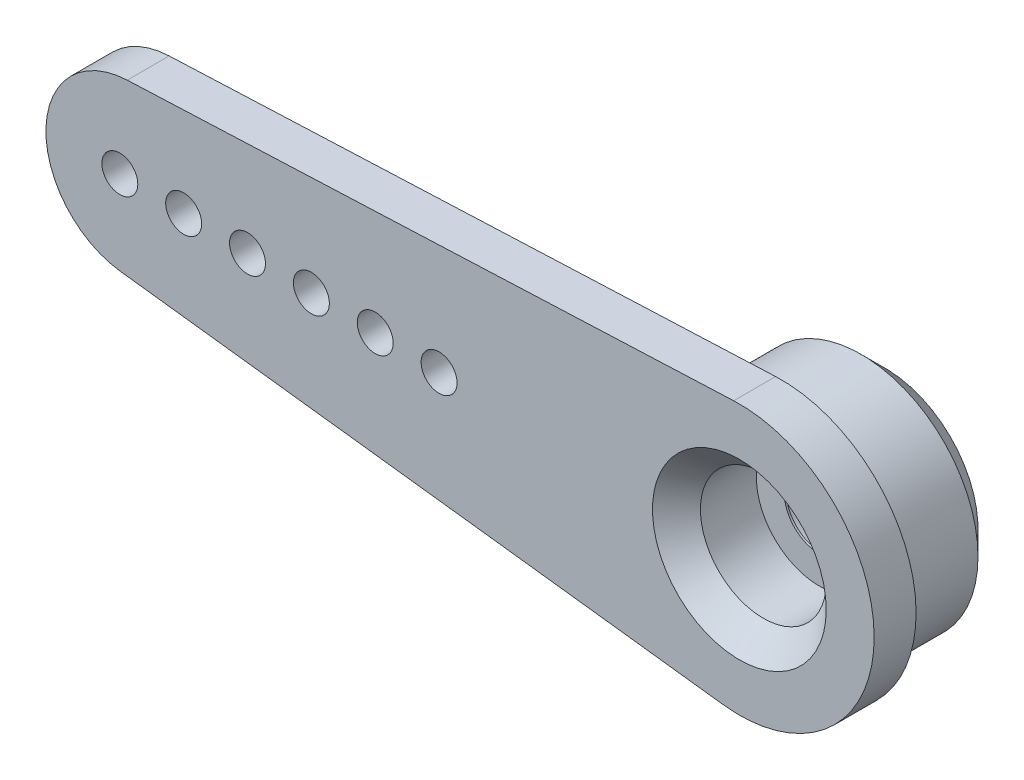
ISO-10303-21;
HEADER;
FILE_DESCRIPTION(('STEP AP214'),'2;1');
FILE_NAME('part.step','',(''),(''),'','','');
FILE_SCHEMA(('AUTOMOTIVE_DESIGN { 1 0 10303 214 1 1 1 1 }'));
ENDSEC;
DATA;
#1=APPLICATION_CONTEXT('core data for automotive mechanical design processes');
#2=APPLICATION_PROTOCOL_DEFINITION('international standard','automotive_design',2000,#1);
#3=PRODUCT_CONTEXT('',#1,'mechanical');
#4=PRODUCT('Part','Part','',(#3));
#5=PRODUCT_RELATED_PRODUCT_CATEGORY('part','',(#4));
#6=PRODUCT_DEFINITION_FORMATION('','',#4);
#7=PRODUCT_DEFINITION_CONTEXT('part definition',#1,'design');
#8=PRODUCT_DEFINITION('design','',#6,#7);
#9=PRODUCT_DEFINITION_SHAPE('','',#8);
#10=(LENGTH_UNIT() NAMED_UNIT(*) SI_UNIT(.MILLI.,.METRE.));
#11=(NAMED_UNIT(*) PLANE_ANGLE_UNIT() SI_UNIT($,.RADIAN.));
#12=(NAMED_UNIT(*) SI_UNIT($,.STERADIAN.) SOLID_ANGLE_UNIT());
#13=UNCERTAINTY_MEASURE_WITH_UNIT(LENGTH_MEASURE(1.E-05),#10,'distance_accuracy_value','');
#14=(GEOMETRIC_REPRESENTATION_CONTEXT(3) GLOBAL_UNCERTAINTY_ASSIGNED_CONTEXT((#13)) GLOBAL_UNIT_ASSIGNED_CONTEXT((#10,
#11,#12)) REPRESENTATION_CONTEXT('',''));
#15=CARTESIAN_POINT('',(0.,0.,0.));
#16=DIRECTION('',(0.,0.,1.));
#17=DIRECTION('',(1.,0.,0.));
#18=AXIS2_PLACEMENT_3D('',#15,#16,#17);
#19=CARTESIAN_POINT('',(30.4756920576618,-1.21745373898422,2.1));
#20=DIRECTION('',(0.,0.,-1.));
#21=DIRECTION('',(-1.,0.,0.));
#22=AXIS2_PLACEMENT_3D('',#19,#20,#21);
#23=CYLINDRICAL_SURFACE('',#22,1.75);
#24=CARTESIAN_POINT('',(30.4756920576618,-1.21745373898422,-1.9));
#25=DIRECTION('',(0.,0.,1.));
#26=DIRECTION('',(1.,0.,0.));
#27=AXIS2_PLACEMENT_3D('',#24,#25,#26);
#28=CIRCLE('',#27,1.75);
#29=CARTESIAN_POINT('',(32.2256920576618,-1.21745373898422,-1.9));
#30=VERTEX_POINT('',#29);
#31=EDGE_CURVE('E102',#30,#30,#28,.F.);
#32=ORIENTED_EDGE('',*,*,#31,.F.);
#33=EDGE_LOOP('',(#32));
#34=FACE_BOUND('',#33,.T.);
#35=CARTESIAN_POINT('',(30.4756920576618,-1.21745373898422,-2.));
#36=DIRECTION('',(0.,0.,-1.));
#37=DIRECTION('',(-1.,0.,0.));
#38=AXIS2_PLACEMENT_3D('',#35,#36,#37);
#39=CIRCLE('',#38,1.75);
#40=CARTESIAN_POINT('',(28.7256920576618,-1.21745373898422,-2.));
#41=VERTEX_POINT('',#40);
#42=EDGE_CURVE('E116',#41,#41,#39,.F.);
#43=ORIENTED_EDGE('',*,*,#42,.F.);
#44=EDGE_LOOP('',(#43));
#45=FACE_BOUND('',#44,.T.);
#46=ADVANCED_FACE('F31',(#34,#45),#23,.F.);
#47=CARTESIAN_POINT('',(0.,0.,0.));
#48=DIRECTION('',(0.,0.,1.));
#49=DIRECTION('',(1.,0.,0.));
#50=AXIS2_PLACEMENT_3D('',#47,#48,#49);
#51=PLANE('',#50);
#52=CARTESIAN_POINT('',(15.4376958737506,-0.627360062849379,0.));
#53=DIRECTION('',(0.,0.,1.));
#54=DIRECTION('',(1.,0.,0.));
#55=AXIS2_PLACEMENT_3D('',#52,#53,#54);
#56=CIRCLE('',#55,0.899999999999993);
#57=CARTESIAN_POINT('',(16.3376958737506,-0.627360062849379,0.));
#58=VERTEX_POINT('',#57);
#59=EDGE_CURVE('E225',#58,#58,#56,.T.);
#60=ORIENTED_EDGE('',*,*,#59,.T.);
#61=EDGE_LOOP('',(#60));
#62=FACE_BOUND('',#61,.T.);
#63=CARTESIAN_POINT('',(12.2401566990005,-0.501888050279503,0.));
#64=DIRECTION('',(0.,0.,1.));
#65=DIRECTION('',(1.,0.,0.));
#66=AXIS2_PLACEMENT_3D('',#63,#64,#65);
#67=CIRCLE('',#66,0.899999999999993);
#68=CARTESIAN_POINT('',(13.1401566990005,-0.501888050279503,0.));
#69=VERTEX_POINT('',#68);
#70=EDGE_CURVE('E219',#69,#69,#67,.T.);
#71=ORIENTED_EDGE('',*,*,#70,.T.);
#72=EDGE_LOOP('',(#71));
#73=FACE_BOUND('',#72,.T.);
#74=CARTESIAN_POINT('',(9.04261752425036,-0.376416037709628,0.));
#75=DIRECTION('',(0.,0.,1.));
#76=DIRECTION('',(1.,0.,0.));
#77=AXIS2_PLACEMENT_3D('',#74,#75,#76);
#78=CIRCLE('',#77,0.899999999999993);
#79=CARTESIAN_POINT('',(9.94261752425035,-0.376416037709628,0.));
#80=VERTEX_POINT('',#79);
#81=EDGE_CURVE('E213',#80,#80,#78,.T.);
#82=ORIENTED_EDGE('',*,*,#81,.T.);
#83=EDGE_LOOP('',(#82));
#84=FACE_BOUND('',#83,.T.);
#85=CARTESIAN_POINT('',(5.84507834950024,-0.250944025139752,0.));
#86=DIRECTION('',(0.,0.,1.));
#87=DIRECTION('',(1.,0.,0.));
#88=AXIS2_PLACEMENT_3D('',#85,#86,#87);
#89=CIRCLE('',#88,0.899999999999993);
#90=CARTESIAN_POINT('',(6.74507834950023,-0.250944025139752,0.));
#91=VERTEX_POINT('',#90);
#92=EDGE_CURVE('E207',#91,#91,#89,.T.);
#93=ORIENTED_EDGE('',*,*,#92,.T.);
#94=EDGE_LOOP('',(#93));
#95=FACE_BOUND('',#94,.T.);
#96=CARTESIAN_POINT('',(2.64753917475012,-0.125472012569876,0.));
#97=DIRECTION('',(0.,0.,1.));
#98=DIRECTION('',(1.,0.,0.));
#99=AXIS2_PLACEMENT_3D('',#96,#97,#98);
#100=CIRCLE('',#99,0.899999999999993);
#101=CARTESIAN_POINT('',(3.54753917475011,-0.125472012569876,0.));
#102=VERTEX_POINT('',#101);
#103=EDGE_CURVE('E201',#102,#102,#100,.T.);
#104=ORIENTED_EDGE('',*,*,#103,.T.);
#105=EDGE_LOOP('',(#104));
#106=FACE_BOUND('',#105,.T.);
#107=CARTESIAN_POINT('',(-0.55,0.,0.));
#108=DIRECTION('',(0.,0.,1.));
#109=DIRECTION('',(1.,0.,0.));
#110=AXIS2_PLACEMENT_3D('',#107,#108,#109);
#111=CIRCLE('',#110,0.899999999999993);
#112=CARTESIAN_POINT('',(0.349999999999993,0.,0.));
#113=VERTEX_POINT('',#112);
#114=EDGE_CURVE('E193',#113,#113,#111,.T.);
#115=ORIENTED_EDGE('',*,*,#114,.T.);
#116=EDGE_LOOP('',(#115));
#117=FACE_BOUND('',#116,.T.);
#118=CARTESIAN_POINT('',(0.,0.,0.));
#119=DIRECTION('',(0.,0.,1.));
#120=DIRECTION('',(1.,0.,0.));
#121=AXIS2_PLACEMENT_3D('',#118,#119,#120);
#122=CIRCLE('',#121,4.25);
#123=CARTESIAN_POINT('',(-0.179008677112837,4.24622843162239,0.));
#124=VERTEX_POINT('',#123);
#125=CARTESIAN_POINT('',(-0.517157360216176,-4.21841774422286,0.));
#126=VERTEX_POINT('',#125);
#127=EDGE_CURVE('E99',#124,#126,#122,.T.);
#128=ORIENTED_EDGE('',*,*,#127,.F.);
#129=DIRECTION('',(-0.999112572146444,-0.0421196887324321,0.));
#130=VECTOR('',#129,1.);
#131=CARTESIAN_POINT('',(-0.179008677112837,4.24622843162239,0.));
#132=LINE('',#131,#130);
#133=CARTESIAN_POINT('',(30.1913841587179,5.52655612300428,0.));
#134=VERTEX_POINT('',#133);
#135=EDGE_CURVE('E71',#134,#124,#132,.T.);
#136=ORIENTED_EDGE('',*,*,#135,.F.);
#137=CARTESIAN_POINT('',(30.4756920576618,-1.21745373898422,0.));
#138=DIRECTION('',(0.,0.,1.));
#139=DIRECTION('',(1.,0.,0.));
#140=AXIS2_PLACEMENT_3D('',#137,#138,#139);
#141=CIRCLE('',#140,6.75);
#142=CARTESIAN_POINT('',(29.6543244855538,-7.91729368569111,0.));
#143=VERTEX_POINT('',#142);
#144=EDGE_CURVE('E65',#143,#134,#141,.T.);
#145=ORIENTED_EDGE('',*,*,#144,.F.);
#146=DIRECTION('',(0.992568880993613,-0.121684084756747,0.));
#147=VECTOR('',#146,1.);
#148=CARTESIAN_POINT('',(-0.517157360216176,-4.21841774422286,0.));
#149=LINE('',#148,#147);
#150=EDGE_CURVE('E89',#126,#143,#149,.T.);
#151=ORIENTED_EDGE('',*,*,#150,.F.);
#152=EDGE_LOOP('',(#128,#136,#145,#151));
#153=FACE_BOUND('',#152,.T.);
#154=CARTESIAN_POINT('',(30.4756920576618,-1.21745373898422,0.));
#155=DIRECTION('',(0.,0.,1.));
#156=DIRECTION('',(1.,0.,0.));
#157=AXIS2_PLACEMENT_3D('',#154,#155,#156);
#158=CIRCLE('',#157,5.85);
#159=CARTESIAN_POINT('',(36.3256920576618,-1.21745373898422,0.));
#160=VERTEX_POINT('',#159);
#161=EDGE_CURVE('E109',#160,#160,#158,.F.);
#162=ORIENTED_EDGE('',*,*,#161,.F.);
#163=EDGE_LOOP('',(#162));
#164=FACE_BOUND('',#163,.T.);
#165=ADVANCED_FACE('F145',(#62,#73,#84,#95,#106,#117,#153,#164),#51,.F.);
#166=CARTESIAN_POINT('',(0.,0.,2.1));
#167=DIRECTION('',(0.,0.,-1.));
#168=DIRECTION('',(-1.,0.,0.));
#169=AXIS2_PLACEMENT_3D('',#166,#167,#168);
#170=CYLINDRICAL_SURFACE('',#169,4.25);
#171=ORIENTED_EDGE('',*,*,#127,.T.);
#172=DIRECTION('',(0.,0.,-1.));
#173=VECTOR('',#172,1.);
#174=CARTESIAN_POINT('',(-0.517157360216176,-4.21841774422286,2.1));
#175=LINE('',#174,#173);
#176=CARTESIAN_POINT('',(-0.517157360216176,-4.21841774422286,2.1));
#177=VERTEX_POINT('',#176);
#178=EDGE_CURVE('E90',#177,#126,#175,.T.);
#179=ORIENTED_EDGE('',*,*,#178,.F.);
#180=CARTESIAN_POINT('',(0.,0.,2.1));
#181=DIRECTION('',(0.,0.,1.));
#182=DIRECTION('',(1.,0.,0.));
#183=AXIS2_PLACEMENT_3D('',#180,#181,#182);
#184=CIRCLE('',#183,4.25);
#185=CARTESIAN_POINT('',(-0.179008677112837,4.24622843162239,2.1));
#186=VERTEX_POINT('',#185);
#187=EDGE_CURVE('E84',#186,#177,#184,.T.);
#188=ORIENTED_EDGE('',*,*,#187,.F.);
#189=DIRECTION('',(0.,0.,-1.));
#190=VECTOR('',#189,1.);
#191=CARTESIAN_POINT('',(-0.179008677112837,4.24622843162239,2.1));
#192=LINE('',#191,#190);
#193=EDGE_CURVE('E95',#186,#124,#192,.T.);
#194=ORIENTED_EDGE('',*,*,#193,.T.);
#195=EDGE_LOOP('',(#171,#179,#188,#194));
#196=FACE_BOUND('',#195,.T.);
#197=ADVANCED_FACE('F152',(#196),#170,.T.);
#198=CARTESIAN_POINT('',(-0.517157360216176,-4.21841774422286,2.1));
#199=DIRECTION('',(0.121684084756747,0.992568880993613,0.));
#200=DIRECTION('',(-0.992568880993613,0.121684084756747,0.));
#201=AXIS2_PLACEMENT_3D('',#198,#199,#200);
#202=PLANE('',#201);
#203=ORIENTED_EDGE('',*,*,#150,.T.);
#204=DIRECTION('',(0.,0.,-1.));
#205=VECTOR('',#204,1.);
#206=CARTESIAN_POINT('',(29.6543244855538,-7.91729368569111,2.1));
#207=LINE('',#206,#205);
#208=CARTESIAN_POINT('',(29.6543244855538,-7.91729368569111,2.1));
#209=VERTEX_POINT('',#208);
#210=EDGE_CURVE('E87',#209,#143,#207,.T.);
#211=ORIENTED_EDGE('',*,*,#210,.F.);
#212=DIRECTION('',(0.992568880993613,-0.121684084756747,0.));
#213=VECTOR('',#212,1.);
#214=CARTESIAN_POINT('',(-0.517157360216176,-4.21841774422286,2.1));
#215=LINE('',#214,#213);
#216=EDGE_CURVE('E79',#177,#209,#215,.T.);
#217=ORIENTED_EDGE('',*,*,#216,.F.);
#218=ORIENTED_EDGE('',*,*,#178,.T.);
#219=EDGE_LOOP('',(#203,#211,#217,#218));
#220=FACE_BOUND('',#219,.T.);
#221=ADVANCED_FACE('F88',(#220),#202,.F.);
#222=CARTESIAN_POINT('',(30.4756920576618,-1.21745373898422,2.1));
#223=DIRECTION('',(0.,0.,-1.));
#224=DIRECTION('',(-1.,0.,0.));
#225=AXIS2_PLACEMENT_3D('',#222,#223,#224);
#226=CYLINDRICAL_SURFACE('',#225,6.75);
#227=ORIENTED_EDGE('',*,*,#144,.T.);
#228=DIRECTION('',(0.,0.,-1.));
#229=VECTOR('',#228,1.);
#230=CARTESIAN_POINT('',(30.1913841587179,5.52655612300428,2.1));
#231=LINE('',#230,#229);
#232=CARTESIAN_POINT('',(30.1913841587179,5.52655612300428,2.1));
#233=VERTEX_POINT('',#232);
#234=EDGE_CURVE('E91',#233,#134,#231,.T.);
#235=ORIENTED_EDGE('',*,*,#234,.F.);
#236=CARTESIAN_POINT('',(30.4756920576618,-1.21745373898422,2.1));
#237=DIRECTION('',(0.,0.,1.));
#238=DIRECTION('',(1.,0.,0.));
#239=AXIS2_PLACEMENT_3D('',#236,#237,#238);
#240=CIRCLE('',#239,6.75);
#241=EDGE_CURVE('E82',#209,#233,#240,.T.);
#242=ORIENTED_EDGE('',*,*,#241,.F.);
#243=ORIENTED_EDGE('',*,*,#210,.T.);
#244=EDGE_LOOP('',(#227,#235,#242,#243));
#245=FACE_BOUND('',#244,.T.);
#246=ADVANCED_FACE('F93',(#245),#226,.T.);
#247=CARTESIAN_POINT('',(-0.179008677112837,4.24622843162239,2.1));
#248=DIRECTION('',(0.0421196887324322,-0.999112572146444,0.));
#249=DIRECTION('',(0.999112572146444,0.0421196887324322,0.));
#250=AXIS2_PLACEMENT_3D('',#247,#248,#249);
#251=PLANE('',#250);
#252=ORIENTED_EDGE('',*,*,#135,.T.);
#253=ORIENTED_EDGE('',*,*,#193,.F.);
#254=DIRECTION('',(-0.999112572146444,-0.0421196887324321,0.));
#255=VECTOR('',#254,1.);
#256=CARTESIAN_POINT('',(-0.179008677112837,4.24622843162239,2.1));
#257=LINE('',#256,#255);
#258=EDGE_CURVE('E48',#233,#186,#257,.T.);
#259=ORIENTED_EDGE('',*,*,#258,.F.);
#260=ORIENTED_EDGE('',*,*,#234,.T.);
#261=EDGE_LOOP('',(#252,#253,#259,#260));
#262=FACE_BOUND('',#261,.T.);
#263=ADVANCED_FACE('F169',(#262),#251,.F.);
#264=CARTESIAN_POINT('',(0.,0.,2.1));
#265=DIRECTION('',(0.,0.,1.));
#266=DIRECTION('',(1.,0.,0.));
#267=AXIS2_PLACEMENT_3D('',#264,#265,#266);
#268=PLANE('',#267);
#269=CARTESIAN_POINT('',(15.4376958737506,-0.627360062849379,2.1));
#270=DIRECTION('',(0.,0.,1.));
#271=DIRECTION('',(1.,0.,0.));
#272=AXIS2_PLACEMENT_3D('',#269,#270,#271);
#273=CIRCLE('',#272,0.899999999999986);
#274=CARTESIAN_POINT('',(16.3376958737506,-0.627360062849379,2.1));
#275=VERTEX_POINT('',#274);
#276=EDGE_CURVE('E228',#275,#275,#273,.T.);
#277=ORIENTED_EDGE('',*,*,#276,.F.);
#278=EDGE_LOOP('',(#277));
#279=FACE_BOUND('',#278,.T.);
#280=CARTESIAN_POINT('',(12.2401566990005,-0.501888050279503,2.1));
#281=DIRECTION('',(0.,0.,1.));
#282=DIRECTION('',(1.,0.,0.));
#283=AXIS2_PLACEMENT_3D('',#280,#281,#282);
#284=CIRCLE('',#283,0.899999999999988);
#285=CARTESIAN_POINT('',(13.1401566990005,-0.501888050279503,2.1));
#286=VERTEX_POINT('',#285);
#287=EDGE_CURVE('E222',#286,#286,#284,.T.);
#288=ORIENTED_EDGE('',*,*,#287,.F.);
#289=EDGE_LOOP('',(#288));
#290=FACE_BOUND('',#289,.T.);
#291=CARTESIAN_POINT('',(9.04261752425036,-0.376416037709628,2.1));
#292=DIRECTION('',(0.,0.,1.));
#293=DIRECTION('',(1.,0.,0.));
#294=AXIS2_PLACEMENT_3D('',#291,#292,#293);
#295=CIRCLE('',#294,0.899999999999988);
#296=CARTESIAN_POINT('',(9.94261752425034,-0.376416037709628,2.1));
#297=VERTEX_POINT('',#296);
#298=EDGE_CURVE('E216',#297,#297,#295,.T.);
#299=ORIENTED_EDGE('',*,*,#298,.F.);
#300=EDGE_LOOP('',(#299));
#301=FACE_BOUND('',#300,.T.);
#302=CARTESIAN_POINT('',(5.84507834950024,-0.250944025139752,2.1));
#303=DIRECTION('',(0.,0.,1.));
#304=DIRECTION('',(1.,0.,0.));
#305=AXIS2_PLACEMENT_3D('',#302,#303,#304);
#306=CIRCLE('',#305,0.899999999999988);
#307=CARTESIAN_POINT('',(6.74507834950022,-0.250944025139752,2.1));
#308=VERTEX_POINT('',#307);
#309=EDGE_CURVE('E210',#308,#308,#306,.T.);
#310=ORIENTED_EDGE('',*,*,#309,.F.);
#311=EDGE_LOOP('',(#310));
#312=FACE_BOUND('',#311,.T.);
#313=CARTESIAN_POINT('',(2.64753917475012,-0.125472012569876,2.1));
#314=DIRECTION('',(0.,0.,1.));
#315=DIRECTION('',(1.,0.,0.));
#316=AXIS2_PLACEMENT_3D('',#313,#314,#315);
#317=CIRCLE('',#316,0.899999999999988);
#318=CARTESIAN_POINT('',(3.54753917475011,-0.125472012569876,2.1));
#319=VERTEX_POINT('',#318);
#320=EDGE_CURVE('E204',#319,#319,#317,.T.);
#321=ORIENTED_EDGE('',*,*,#320,.F.);
#322=EDGE_LOOP('',(#321));
#323=FACE_BOUND('',#322,.T.);
#324=CARTESIAN_POINT('',(-0.55,0.,2.1));
#325=DIRECTION('',(0.,0.,1.));
#326=DIRECTION('',(1.,0.,0.));
#327=AXIS2_PLACEMENT_3D('',#324,#325,#326);
#328=CIRCLE('',#327,0.899999999999988);
#329=CARTESIAN_POINT('',(0.349999999999988,0.,2.1));
#330=VERTEX_POINT('',#329);
#331=EDGE_CURVE('E198',#330,#330,#328,.T.);
#332=ORIENTED_EDGE('',*,*,#331,.F.);
#333=EDGE_LOOP('',(#332));
#334=FACE_BOUND('',#333,.T.);
#335=CARTESIAN_POINT('',(30.4756920576618,-1.21745373898422,2.1));
#336=DIRECTION('',(0.,0.,1.));
#337=DIRECTION('',(1.,0.,0.));
#338=AXIS2_PLACEMENT_3D('',#335,#336,#337);
#339=CIRCLE('',#338,4.35);
#340=CARTESIAN_POINT('',(34.8256920576618,-1.21745373898422,2.1));
#341=VERTEX_POINT('',#340);
#342=EDGE_CURVE('E122',#341,#341,#339,.F.);
#343=ORIENTED_EDGE('',*,*,#342,.T.);
#344=EDGE_LOOP('',(#343));
#345=FACE_BOUND('',#344,.T.);
#346=ORIENTED_EDGE('',*,*,#187,.T.);
#347=ORIENTED_EDGE('',*,*,#216,.T.);
#348=ORIENTED_EDGE('',*,*,#241,.T.);
#349=ORIENTED_EDGE('',*,*,#258,.T.);
#350=EDGE_LOOP('',(#346,#347,#348,#349));
#351=FACE_BOUND('',#350,.T.);
#352=ADVANCED_FACE('F80',(#279,#290,#301,#312,#323,#334,#345,#351),#268,.T.);
#353=CARTESIAN_POINT('',(30.4756920576618,-1.21745373898422,-5.2));
#354=DIRECTION('',(0.,0.,1.));
#355=DIRECTION('',(1.,0.,0.));
#356=AXIS2_PLACEMENT_3D('',#353,#354,#355);
#357=CYLINDRICAL_SURFACE('',#356,5.85);
#358=CARTESIAN_POINT('',(30.4756920576618,-1.21745373898422,-3.99999999999999));
#359=DIRECTION('',(0.,0.,-1.));
#360=DIRECTION('',(-1.,0.,0.));
#361=AXIS2_PLACEMENT_3D('',#358,#359,#360);
#362=CIRCLE('',#361,5.85);
#363=CARTESIAN_POINT('',(24.6256920576618,-1.21745373898422,-3.99999999999999));
#364=VERTEX_POINT('',#363);
#365=EDGE_CURVE('E11',#364,#364,#362,.F.);
#366=ORIENTED_EDGE('',*,*,#365,.T.);
#367=EDGE_LOOP('',(#366));
#368=FACE_BOUND('',#367,.T.);
#369=ORIENTED_EDGE('',*,*,#161,.T.);
#370=EDGE_LOOP('',(#369));
#371=FACE_BOUND('',#370,.T.);
#372=ADVANCED_FACE('F164',(#368,#371),#357,.T.);
#373=CARTESIAN_POINT('',(30.4756920576618,-1.21745373898422,-5.2));
#374=DIRECTION('',(0.,0.,-1.));
#375=DIRECTION('',(-1.,0.,0.));
#376=AXIS2_PLACEMENT_3D('',#373,#374,#375);
#377=PLANE('',#376);
#378=CARTESIAN_POINT('',(30.4756920576618,-1.21745373898422,-5.2));
#379=DIRECTION('',(0.,0.,-1.));
#380=DIRECTION('',(-1.,0.,0.));
#381=AXIS2_PLACEMENT_3D('',#378,#379,#380);
#382=CIRCLE('',#381,4.65);
#383=CARTESIAN_POINT('',(25.8256920576618,-1.21745373898422,-5.2));
#384=VERTEX_POINT('',#383);
#385=EDGE_CURVE('E40',#384,#384,#382,.T.);
#386=ORIENTED_EDGE('',*,*,#385,.T.);
#387=EDGE_LOOP('',(#386));
#388=FACE_BOUND('',#387,.T.);
#389=CARTESIAN_POINT('',(30.4756920576618,-1.21745373898422,-5.2));
#390=DIRECTION('',(0.,0.,-1.));
#391=DIRECTION('',(-1.,0.,0.));
#392=AXIS2_PLACEMENT_3D('',#389,#390,#391);
#393=CIRCLE('',#392,2.95);
#394=CARTESIAN_POINT('',(27.5256920576618,-1.21745373898422,-5.2));
#395=VERTEX_POINT('',#394);
#396=EDGE_CURVE('E190',#395,#395,#393,.T.);
#397=ORIENTED_EDGE('',*,*,#396,.F.);
#398=EDGE_LOOP('',(#397));
#399=FACE_BOUND('',#398,.T.);
#400=ADVANCED_FACE('F127',(#388,#399),#377,.T.);
#401=CARTESIAN_POINT('',(30.4756920576618,-1.21745373898422,-1.9));
#402=DIRECTION('',(0.,0.,1.));
#403=DIRECTION('',(1.,0.,0.));
#404=AXIS2_PLACEMENT_3D('',#401,#402,#403);
#405=PLANE('',#404);
#406=CARTESIAN_POINT('',(30.4756920576618,-1.21745373898422,-1.9));
#407=DIRECTION('',(0.,0.,1.));
#408=DIRECTION('',(1.,0.,0.));
#409=AXIS2_PLACEMENT_3D('',#406,#407,#408);
#410=CIRCLE('',#409,3.15);
#411=CARTESIAN_POINT('',(33.6256920576618,-1.21745373898422,-1.9));
#412=VERTEX_POINT('',#411);
#413=EDGE_CURVE('E115',#412,#412,#410,.T.);
#414=ORIENTED_EDGE('',*,*,#413,.T.);
#415=EDGE_LOOP('',(#414));
#416=FACE_BOUND('',#415,.T.);
#417=ORIENTED_EDGE('',*,*,#31,.T.);
#418=EDGE_LOOP('',(#417));
#419=FACE_BOUND('',#418,.T.);
#420=ADVANCED_FACE('F163',(#416,#419),#405,.T.);
#421=CARTESIAN_POINT('',(30.4756920576618,-1.21745373898422,-1.9));
#422=DIRECTION('',(0.,0.,1.));
#423=DIRECTION('',(1.,0.,0.));
#424=AXIS2_PLACEMENT_3D('',#421,#422,#423);
#425=CYLINDRICAL_SURFACE('',#424,3.15);
#426=CARTESIAN_POINT('',(30.4756920576618,-1.21745373898422,0.900000000000003));
#427=DIRECTION('',(0.,0.,1.));
#428=DIRECTION('',(1.,0.,0.));
#429=AXIS2_PLACEMENT_3D('',#426,#427,#428);
#430=CIRCLE('',#429,3.15);
#431=CARTESIAN_POINT('',(33.6256920576618,-1.21745373898422,0.900000000000003));
#432=VERTEX_POINT('',#431);
#433=EDGE_CURVE('E112',#432,#432,#430,.T.);
#434=ORIENTED_EDGE('',*,*,#433,.T.);
#435=EDGE_LOOP('',(#434));
#436=FACE_BOUND('',#435,.T.);
#437=ORIENTED_EDGE('',*,*,#413,.F.);
#438=EDGE_LOOP('',(#437));
#439=FACE_BOUND('',#438,.T.);
#440=ADVANCED_FACE('F159',(#436,#439),#425,.F.);
#441=CARTESIAN_POINT('',(30.4756920576618,-1.21745373898422,-2.));
#442=DIRECTION('',(0.,0.,-1.));
#443=DIRECTION('',(-1.,0.,0.));
#444=AXIS2_PLACEMENT_3D('',#441,#442,#443);
#445=PLANE('',#444);
#446=CARTESIAN_POINT('',(30.4756920576618,-1.21745373898422,-2.));
#447=DIRECTION('',(0.,0.,-1.));
#448=DIRECTION('',(-1.,0.,0.));
#449=AXIS2_PLACEMENT_3D('',#446,#447,#448);
#450=CIRCLE('',#449,2.95);
#451=CARTESIAN_POINT('',(27.5256920576618,-1.21745373898422,-2.));
#452=VERTEX_POINT('',#451);
#453=EDGE_CURVE('E119',#452,#452,#450,.T.);
#454=ORIENTED_EDGE('',*,*,#453,.T.);
#455=EDGE_LOOP('',(#454));
#456=FACE_BOUND('',#455,.T.);
#457=ORIENTED_EDGE('',*,*,#42,.T.);
#458=EDGE_LOOP('',(#457));
#459=FACE_BOUND('',#458,.T.);
#460=ADVANCED_FACE('F251',(#456,#459),#445,.T.);
#461=CARTESIAN_POINT('',(30.4756920576618,-1.21745373898422,-2.));
#462=DIRECTION('',(0.,0.,-1.));
#463=DIRECTION('',(-1.,0.,0.));
#464=AXIS2_PLACEMENT_3D('',#461,#462,#463);
#465=CYLINDRICAL_SURFACE('',#464,2.95);
#466=ORIENTED_EDGE('',*,*,#453,.F.);
#467=EDGE_LOOP('',(#466));
#468=FACE_BOUND('',#467,.T.);
#469=ORIENTED_EDGE('',*,*,#396,.T.);
#470=EDGE_LOOP('',(#469));
#471=FACE_BOUND('',#470,.T.);
#472=ADVANCED_FACE('F141',(#468,#471),#465,.F.);
#473=CARTESIAN_POINT('',(30.4756920576618,-1.21745373898422,0.900000000000003));
#474=DIRECTION('',(0.,0.,1.));
#475=DIRECTION('',(1.,0.,0.));
#476=AXIS2_PLACEMENT_3D('',#473,#474,#475);
#477=CONICAL_SURFACE('',#476,3.15,0.785398163397449);
#478=ORIENTED_EDGE('',*,*,#342,.F.);
#479=EDGE_LOOP('',(#478));
#480=FACE_BOUND('',#479,.T.);
#481=ORIENTED_EDGE('',*,*,#433,.F.);
#482=EDGE_LOOP('',(#481));
#483=FACE_BOUND('',#482,.T.);
#484=ADVANCED_FACE('F132',(#480,#483),#477,.F.);
#485=CARTESIAN_POINT('',(30.4756920576618,-1.21745373898422,-5.2));
#486=DIRECTION('',(0.,0.,1.));
#487=DIRECTION('',(1.,0.,0.));
#488=AXIS2_PLACEMENT_3D('',#485,#486,#487);
#489=CONICAL_SURFACE('',#488,4.65,0.785398163397443);
#490=ORIENTED_EDGE('',*,*,#365,.F.);
#491=EDGE_LOOP('',(#490));
#492=FACE_BOUND('',#491,.T.);
#493=ORIENTED_EDGE('',*,*,#385,.F.);
#494=EDGE_LOOP('',(#493));
#495=FACE_BOUND('',#494,.T.);
#496=ADVANCED_FACE('F33',(#492,#495),#489,.T.);
#497=CARTESIAN_POINT('',(-0.55,0.,2.1));
#498=DIRECTION('',(0.,0.,1.));
#499=DIRECTION('',(1.,0.,0.));
#500=AXIS2_PLACEMENT_3D('',#497,#498,#499);
#501=CYLINDRICAL_SURFACE('',#500,0.899999999999993);
#502=ORIENTED_EDGE('',*,*,#331,.T.);
#503=EDGE_LOOP('',(#502));
#504=FACE_BOUND('',#503,.T.);
#505=ORIENTED_EDGE('',*,*,#114,.F.);
#506=EDGE_LOOP('',(#505));
#507=FACE_BOUND('',#506,.T.);
#508=ADVANCED_FACE('F131',(#504,#507),#501,.F.);
#509=CARTESIAN_POINT('',(2.64753917475012,-0.125472012569876,2.1));
#510=DIRECTION('',(0.,0.,1.));
#511=DIRECTION('',(1.,0.,0.));
#512=AXIS2_PLACEMENT_3D('',#509,#510,#511);
#513=CYLINDRICAL_SURFACE('',#512,0.899999999999993);
#514=ORIENTED_EDGE('',*,*,#320,.T.);
#515=EDGE_LOOP('',(#514));
#516=FACE_BOUND('',#515,.T.);
#517=ORIENTED_EDGE('',*,*,#103,.F.);
#518=EDGE_LOOP('',(#517));
#519=FACE_BOUND('',#518,.T.);
#520=ADVANCED_FACE('F138',(#516,#519),#513,.F.);
#521=CARTESIAN_POINT('',(5.84507834950024,-0.250944025139752,2.1));
#522=DIRECTION('',(0.,0.,1.));
#523=DIRECTION('',(1.,0.,0.));
#524=AXIS2_PLACEMENT_3D('',#521,#522,#523);
#525=CYLINDRICAL_SURFACE('',#524,0.899999999999993);
#526=ORIENTED_EDGE('',*,*,#309,.T.);
#527=EDGE_LOOP('',(#526));
#528=FACE_BOUND('',#527,.T.);
#529=ORIENTED_EDGE('',*,*,#92,.F.);
#530=EDGE_LOOP('',(#529));
#531=FACE_BOUND('',#530,.T.);
#532=ADVANCED_FACE('F267',(#528,#531),#525,.F.);
#533=CARTESIAN_POINT('',(9.04261752425036,-0.376416037709628,2.1));
#534=DIRECTION('',(0.,0.,1.));
#535=DIRECTION('',(1.,0.,0.));
#536=AXIS2_PLACEMENT_3D('',#533,#534,#535);
#537=CYLINDRICAL_SURFACE('',#536,0.899999999999993);
#538=ORIENTED_EDGE('',*,*,#298,.T.);
#539=EDGE_LOOP('',(#538));
#540=FACE_BOUND('',#539,.T.);
#541=ORIENTED_EDGE('',*,*,#81,.F.);
#542=EDGE_LOOP('',(#541));
#543=FACE_BOUND('',#542,.T.);
#544=ADVANCED_FACE('F271',(#540,#543),#537,.F.);
#545=CARTESIAN_POINT('',(12.2401566990005,-0.501888050279503,2.1));
#546=DIRECTION('',(0.,0.,1.));
#547=DIRECTION('',(1.,0.,0.));
#548=AXIS2_PLACEMENT_3D('',#545,#546,#547);
#549=CYLINDRICAL_SURFACE('',#548,0.899999999999993);
#550=ORIENTED_EDGE('',*,*,#287,.T.);
#551=EDGE_LOOP('',(#550));
#552=FACE_BOUND('',#551,.T.);
#553=ORIENTED_EDGE('',*,*,#70,.F.);
#554=EDGE_LOOP('',(#553));
#555=FACE_BOUND('',#554,.T.);
#556=ADVANCED_FACE('F275',(#552,#555),#549,.F.);
#557=CARTESIAN_POINT('',(15.4376958737506,-0.627360062849379,2.1));
#558=DIRECTION('',(0.,0.,1.));
#559=DIRECTION('',(1.,0.,0.));
#560=AXIS2_PLACEMENT_3D('',#557,#558,#559);
#561=CYLINDRICAL_SURFACE('',#560,0.899999999999993);
#562=ORIENTED_EDGE('',*,*,#276,.T.);
#563=EDGE_LOOP('',(#562));
#564=FACE_BOUND('',#563,.T.);
#565=ORIENTED_EDGE('',*,*,#59,.F.);
#566=EDGE_LOOP('',(#565));
#567=FACE_BOUND('',#566,.T.);
#568=ADVANCED_FACE('F232',(#564,#567),#561,.F.);
#569=CLOSED_SHELL('',(#46,#165,#197,#221,#246,#263,#352,#372,#400,#420,#440,#460,#472,#484,#496,
#508,#520,#532,#544,#556,#568));
#570=MANIFOLD_SOLID_BREP('B2',#569);
#571=ADVANCED_BREP_SHAPE_REPRESENTATION('',(#18,#570),#14);
#572=SHAPE_DEFINITION_REPRESENTATION(#9,#571);
ENDSEC;
END-ISO-10303-21;
